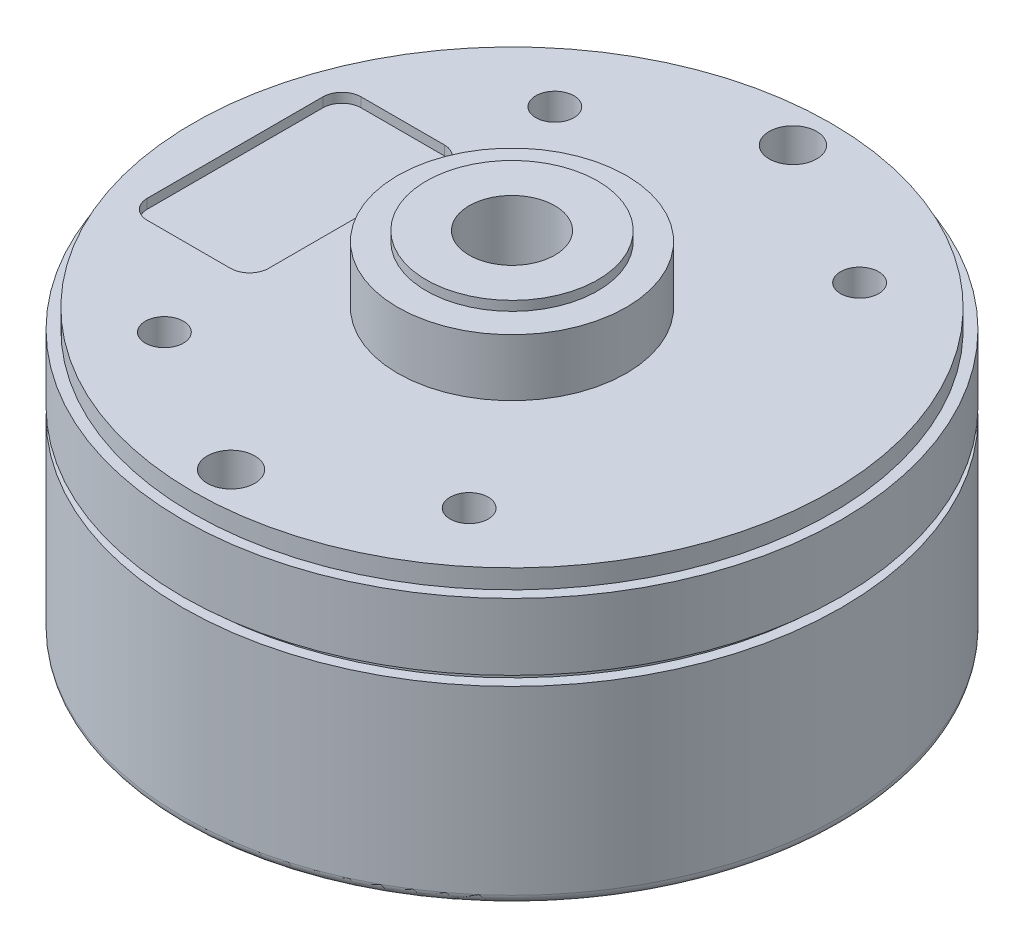
ISO-10303-21;
HEADER;
FILE_DESCRIPTION(('STEP AP214'),'2;1');
FILE_NAME('part.step','',(''),(''),'','','');
FILE_SCHEMA(('AUTOMOTIVE_DESIGN { 1 0 10303 214 1 1 1 1 }'));
ENDSEC;
DATA;
#1=APPLICATION_CONTEXT('core data for automotive mechanical design processes');
#2=APPLICATION_PROTOCOL_DEFINITION('international standard','automotive_design',2000,#1);
#3=PRODUCT_CONTEXT('',#1,'mechanical');
#4=PRODUCT('Part','Part','',(#3));
#5=PRODUCT_RELATED_PRODUCT_CATEGORY('part','',(#4));
#6=PRODUCT_DEFINITION_FORMATION('','',#4);
#7=PRODUCT_DEFINITION_CONTEXT('part definition',#1,'design');
#8=PRODUCT_DEFINITION('design','',#6,#7);
#9=PRODUCT_DEFINITION_SHAPE('','',#8);
#10=(LENGTH_UNIT() NAMED_UNIT(*) SI_UNIT(.MILLI.,.METRE.));
#11=(NAMED_UNIT(*) PLANE_ANGLE_UNIT() SI_UNIT($,.RADIAN.));
#12=(NAMED_UNIT(*) SI_UNIT($,.STERADIAN.) SOLID_ANGLE_UNIT());
#13=UNCERTAINTY_MEASURE_WITH_UNIT(LENGTH_MEASURE(1.E-05),#10,'distance_accuracy_value','');
#14=(GEOMETRIC_REPRESENTATION_CONTEXT(3) GLOBAL_UNCERTAINTY_ASSIGNED_CONTEXT((#13)) GLOBAL_UNIT_ASSIGNED_CONTEXT((#10,
#11,#12)) REPRESENTATION_CONTEXT('',''));
#15=CARTESIAN_POINT('',(0.,0.,0.));
#16=DIRECTION('',(0.,0.,1.));
#17=DIRECTION('',(1.,0.,0.));
#18=AXIS2_PLACEMENT_3D('',#15,#16,#17);
#19=CARTESIAN_POINT('',(0.,0.,0.));
#20=DIRECTION('',(0.,-1.,0.));
#21=DIRECTION('',(0.,0.,-1.));
#22=AXIS2_PLACEMENT_3D('',#19,#20,#21);
#23=CYLINDRICAL_SURFACE('',#22,2.25);
#24=CARTESIAN_POINT('',(0.,18.5,0.));
#25=DIRECTION('',(0.,-1.,0.));
#26=DIRECTION('',(0.,0.,-1.));
#27=AXIS2_PLACEMENT_3D('',#24,#25,#26);
#28=CIRCLE('',#27,2.25);
#29=CARTESIAN_POINT('',(0.,18.5,-2.25));
#30=VERTEX_POINT('',#29);
#31=EDGE_CURVE('E296',#30,#30,#28,.T.);
#32=ORIENTED_EDGE('',*,*,#31,.F.);
#33=EDGE_LOOP('',(#32));
#34=FACE_BOUND('',#33,.T.);
#35=CARTESIAN_POINT('',(0.,1.,0.));
#36=DIRECTION('',(0.,-1.,0.));
#37=DIRECTION('',(0.,0.,-1.));
#38=AXIS2_PLACEMENT_3D('',#35,#36,#37);
#39=CIRCLE('',#38,2.25);
#40=CARTESIAN_POINT('',(0.,1.,-2.25));
#41=VERTEX_POINT('',#40);
#42=EDGE_CURVE('E47',#41,#41,#39,.T.);
#43=ORIENTED_EDGE('',*,*,#42,.T.);
#44=EDGE_LOOP('',(#43));
#45=FACE_BOUND('',#44,.T.);
#46=ADVANCED_FACE('F43',(#34,#45),#23,.F.);
#47=CARTESIAN_POINT('',(17.3,0.,0.));
#48=DIRECTION('',(0.,-1.,0.));
#49=DIRECTION('',(0.,0.,-1.));
#50=AXIS2_PLACEMENT_3D('',#47,#48,#49);
#51=PLANE('',#50);
#52=CARTESIAN_POINT('',(0.,0.,0.));
#53=DIRECTION('',(0.,-1.,0.));
#54=DIRECTION('',(0.,0.,-1.));
#55=AXIS2_PLACEMENT_3D('',#52,#53,#54);
#56=CIRCLE('',#55,3.2);
#57=CARTESIAN_POINT('',(0.,0.,-3.2));
#58=VERTEX_POINT('',#57);
#59=EDGE_CURVE('E164',#58,#58,#56,.T.);
#60=ORIENTED_EDGE('',*,*,#59,.F.);
#61=EDGE_LOOP('',(#60));
#62=FACE_BOUND('',#61,.T.);
#63=CARTESIAN_POINT('',(-5.25,0.,5.25));
#64=DIRECTION('',(0.,-1.,0.));
#65=DIRECTION('',(0.,0.,-1.));
#66=AXIS2_PLACEMENT_3D('',#63,#64,#65);
#67=CIRCLE('',#66,1.25);
#68=CARTESIAN_POINT('',(-5.25,0.,4.));
#69=VERTEX_POINT('',#68);
#70=EDGE_CURVE('E216',#69,#69,#67,.T.);
#71=ORIENTED_EDGE('',*,*,#70,.F.);
#72=EDGE_LOOP('',(#71));
#73=FACE_BOUND('',#72,.T.);
#74=CARTESIAN_POINT('',(-6.25,0.,0.));
#75=DIRECTION('',(0.,-1.,0.));
#76=DIRECTION('',(0.,0.,-1.));
#77=AXIS2_PLACEMENT_3D('',#74,#75,#76);
#78=CIRCLE('',#77,1.);
#79=CARTESIAN_POINT('',(-6.25,0.,-1.));
#80=VERTEX_POINT('',#79);
#81=EDGE_CURVE('E210',#80,#80,#78,.T.);
#82=ORIENTED_EDGE('',*,*,#81,.F.);
#83=EDGE_LOOP('',(#82));
#84=FACE_BOUND('',#83,.T.);
#85=CARTESIAN_POINT('',(-5.25,0.,-5.25));
#86=DIRECTION('',(0.,-1.,0.));
#87=DIRECTION('',(0.,0.,-1.));
#88=AXIS2_PLACEMENT_3D('',#85,#86,#87);
#89=CIRCLE('',#88,1.25);
#90=CARTESIAN_POINT('',(-5.25,0.,-6.5));
#91=VERTEX_POINT('',#90);
#92=EDGE_CURVE('E204',#91,#91,#89,.T.);
#93=ORIENTED_EDGE('',*,*,#92,.F.);
#94=EDGE_LOOP('',(#93));
#95=FACE_BOUND('',#94,.T.);
#96=CARTESIAN_POINT('',(0.,0.,-6.25));
#97=DIRECTION('',(0.,-1.,0.));
#98=DIRECTION('',(0.,0.,-1.));
#99=AXIS2_PLACEMENT_3D('',#96,#97,#98);
#100=CIRCLE('',#99,1.);
#101=CARTESIAN_POINT('',(0.,0.,-7.25));
#102=VERTEX_POINT('',#101);
#103=EDGE_CURVE('E198',#102,#102,#100,.T.);
#104=ORIENTED_EDGE('',*,*,#103,.F.);
#105=EDGE_LOOP('',(#104));
#106=FACE_BOUND('',#105,.T.);
#107=CARTESIAN_POINT('',(5.25,0.,-5.25));
#108=DIRECTION('',(0.,-1.,0.));
#109=DIRECTION('',(0.,0.,-1.));
#110=AXIS2_PLACEMENT_3D('',#107,#108,#109);
#111=CIRCLE('',#110,1.25);
#112=CARTESIAN_POINT('',(5.25,0.,-6.5));
#113=VERTEX_POINT('',#112);
#114=EDGE_CURVE('E192',#113,#113,#111,.T.);
#115=ORIENTED_EDGE('',*,*,#114,.F.);
#116=EDGE_LOOP('',(#115));
#117=FACE_BOUND('',#116,.T.);
#118=CARTESIAN_POINT('',(6.25,0.,0.));
#119=DIRECTION('',(0.,-1.,0.));
#120=DIRECTION('',(0.,0.,-1.));
#121=AXIS2_PLACEMENT_3D('',#118,#119,#120);
#122=CIRCLE('',#121,1.);
#123=CARTESIAN_POINT('',(6.25,0.,-1.));
#124=VERTEX_POINT('',#123);
#125=EDGE_CURVE('E186',#124,#124,#122,.T.);
#126=ORIENTED_EDGE('',*,*,#125,.F.);
#127=EDGE_LOOP('',(#126));
#128=FACE_BOUND('',#127,.T.);
#129=CARTESIAN_POINT('',(5.25,0.,5.25));
#130=DIRECTION('',(0.,-1.,0.));
#131=DIRECTION('',(0.,0.,-1.));
#132=AXIS2_PLACEMENT_3D('',#129,#130,#131);
#133=CIRCLE('',#132,1.25);
#134=CARTESIAN_POINT('',(5.25,0.,4.));
#135=VERTEX_POINT('',#134);
#136=EDGE_CURVE('E179',#135,#135,#133,.T.);
#137=ORIENTED_EDGE('',*,*,#136,.F.);
#138=EDGE_LOOP('',(#137));
#139=FACE_BOUND('',#138,.T.);
#140=CARTESIAN_POINT('',(0.,0.,6.25));
#141=DIRECTION('',(0.,-1.,0.));
#142=DIRECTION('',(0.,0.,-1.));
#143=AXIS2_PLACEMENT_3D('',#140,#141,#142);
#144=CIRCLE('',#143,1.);
#145=CARTESIAN_POINT('',(0.,0.,5.25));
#146=VERTEX_POINT('',#145);
#147=EDGE_CURVE('E182',#146,#146,#144,.T.);
#148=ORIENTED_EDGE('',*,*,#147,.F.);
#149=EDGE_LOOP('',(#148));
#150=FACE_BOUND('',#149,.T.);
#151=CARTESIAN_POINT('',(0.,0.,0.));
#152=DIRECTION('',(0.,-1.,0.));
#153=DIRECTION('',(0.,0.,-1.));
#154=AXIS2_PLACEMENT_3D('',#151,#152,#153);
#155=CIRCLE('',#154,16.8);
#156=CARTESIAN_POINT('',(0.,0.,-16.8));
#157=VERTEX_POINT('',#156);
#158=EDGE_CURVE('E52',#157,#157,#155,.T.);
#159=ORIENTED_EDGE('',*,*,#158,.T.);
#160=EDGE_LOOP('',(#159));
#161=FACE_BOUND('',#160,.T.);
#162=ADVANCED_FACE('F302',(#62,#73,#84,#95,#106,#117,#128,#139,#150,#161),#51,.T.);
#163=CARTESIAN_POINT('',(2.25,18.5,0.));
#164=DIRECTION('',(0.,1.,0.));
#165=DIRECTION('',(0.,0.,1.));
#166=AXIS2_PLACEMENT_3D('',#163,#164,#165);
#167=PLANE('',#166);
#168=ORIENTED_EDGE('',*,*,#31,.T.);
#169=EDGE_LOOP('',(#168));
#170=FACE_BOUND('',#169,.T.);
#171=CARTESIAN_POINT('',(0.,18.5,0.));
#172=DIRECTION('',(0.,-1.,0.));
#173=DIRECTION('',(0.,0.,-1.));
#174=AXIS2_PLACEMENT_3D('',#171,#172,#173);
#175=CIRCLE('',#174,4.5);
#176=CARTESIAN_POINT('',(0.,18.5,-4.5));
#177=VERTEX_POINT('',#176);
#178=EDGE_CURVE('E293',#177,#177,#175,.T.);
#179=ORIENTED_EDGE('',*,*,#178,.F.);
#180=EDGE_LOOP('',(#179));
#181=FACE_BOUND('',#180,.T.);
#182=ADVANCED_FACE('F326',(#170,#181),#167,.T.);
#183=CARTESIAN_POINT('',(0.,0.,0.));
#184=DIRECTION('',(0.,-1.,0.));
#185=DIRECTION('',(0.,0.,-1.));
#186=AXIS2_PLACEMENT_3D('',#183,#184,#185);
#187=CYLINDRICAL_SURFACE('',#186,4.5);
#188=ORIENTED_EDGE('',*,*,#178,.T.);
#189=EDGE_LOOP('',(#188));
#190=FACE_BOUND('',#189,.T.);
#191=CARTESIAN_POINT('',(0.,18.,0.));
#192=DIRECTION('',(0.,-1.,0.));
#193=DIRECTION('',(0.,0.,-1.));
#194=AXIS2_PLACEMENT_3D('',#191,#192,#193);
#195=CIRCLE('',#194,4.5);
#196=CARTESIAN_POINT('',(0.,18.,-4.5));
#197=VERTEX_POINT('',#196);
#198=EDGE_CURVE('E290',#197,#197,#195,.T.);
#199=ORIENTED_EDGE('',*,*,#198,.F.);
#200=EDGE_LOOP('',(#199));
#201=FACE_BOUND('',#200,.T.);
#202=ADVANCED_FACE('F333',(#190,#201),#187,.T.);
#203=CARTESIAN_POINT('',(4.5,18.,0.));
#204=DIRECTION('',(0.,1.,0.));
#205=DIRECTION('',(0.,0.,1.));
#206=AXIS2_PLACEMENT_3D('',#203,#204,#205);
#207=PLANE('',#206);
#208=ORIENTED_EDGE('',*,*,#198,.T.);
#209=EDGE_LOOP('',(#208));
#210=FACE_BOUND('',#209,.T.);
#211=CARTESIAN_POINT('',(0.,18.,0.));
#212=DIRECTION('',(0.,-1.,0.));
#213=DIRECTION('',(0.,0.,-1.));
#214=AXIS2_PLACEMENT_3D('',#211,#212,#213);
#215=CIRCLE('',#214,6.);
#216=CARTESIAN_POINT('',(0.,18.,-6.));
#217=VERTEX_POINT('',#216);
#218=EDGE_CURVE('E287',#217,#217,#215,.T.);
#219=ORIENTED_EDGE('',*,*,#218,.F.);
#220=EDGE_LOOP('',(#219));
#221=FACE_BOUND('',#220,.T.);
#222=ADVANCED_FACE('F337',(#210,#221),#207,.T.);
#223=CARTESIAN_POINT('',(0.,0.,0.));
#224=DIRECTION('',(0.,-1.,0.));
#225=DIRECTION('',(0.,0.,-1.));
#226=AXIS2_PLACEMENT_3D('',#223,#224,#225);
#227=CYLINDRICAL_SURFACE('',#226,6.);
#228=ORIENTED_EDGE('',*,*,#218,.T.);
#229=EDGE_LOOP('',(#228));
#230=FACE_BOUND('',#229,.T.);
#231=CARTESIAN_POINT('',(0.,15.,0.));
#232=DIRECTION('',(0.,-1.,0.));
#233=DIRECTION('',(0.,0.,-1.));
#234=AXIS2_PLACEMENT_3D('',#231,#232,#233);
#235=CIRCLE('',#234,6.);
#236=CARTESIAN_POINT('',(0.,15.,-6.));
#237=VERTEX_POINT('',#236);
#238=EDGE_CURVE('E284',#237,#237,#235,.T.);
#239=ORIENTED_EDGE('',*,*,#238,.F.);
#240=EDGE_LOOP('',(#239));
#241=FACE_BOUND('',#240,.T.);
#242=ADVANCED_FACE('F341',(#230,#241),#227,.T.);
#243=CARTESIAN_POINT('',(6.,15.,0.));
#244=DIRECTION('',(0.,1.,0.));
#245=DIRECTION('',(0.,0.,1.));
#246=AXIS2_PLACEMENT_3D('',#243,#244,#245);
#247=PLANE('',#246);
#248=CARTESIAN_POINT('',(-9.16506311086497,15.,4.61398536738231));
#249=DIRECTION('',(0.,1.,0.));
#250=DIRECTION('',(0.,0.,1.));
#251=AXIS2_PLACEMENT_3D('',#248,#249,#250);
#252=CIRCLE('',#251,1.);
#253=CARTESIAN_POINT('',(-9.16506311086497,15.,5.61398536738231));
#254=VERTEX_POINT('',#253);
#255=CARTESIAN_POINT('',(-8.16506311086497,15.,4.61398536738231));
#256=VERTEX_POINT('',#255);
#257=EDGE_CURVE('E59',#254,#256,#252,.T.);
#258=ORIENTED_EDGE('',*,*,#257,.F.);
#259=DIRECTION('',(1.,0.,0.));
#260=VECTOR('',#259,1.);
#261=CARTESIAN_POINT('',(-13.5382356093968,15.,5.61398536738231));
#262=LINE('',#261,#260);
#263=CARTESIAN_POINT('',(-13.5382356093968,15.,5.61398536738231));
#264=VERTEX_POINT('',#263);
#265=EDGE_CURVE('E160',#264,#254,#262,.T.);
#266=ORIENTED_EDGE('',*,*,#265,.F.);
#267=CARTESIAN_POINT('',(-13.5382356093968,15.,4.61398536738231));
#268=DIRECTION('',(0.,1.,0.));
#269=DIRECTION('',(0.,0.,-1.));
#270=AXIS2_PLACEMENT_3D('',#267,#268,#269);
#271=CIRCLE('',#270,1.);
#272=CARTESIAN_POINT('',(-14.5382356093968,15.,4.61398536738231));
#273=VERTEX_POINT('',#272);
#274=EDGE_CURVE('E158',#273,#264,#271,.T.);
#275=ORIENTED_EDGE('',*,*,#274,.F.);
#276=DIRECTION('',(0.,0.,1.));
#277=VECTOR('',#276,1.);
#278=CARTESIAN_POINT('',(-14.5382356093968,15.,4.61398536738231));
#279=LINE('',#278,#277);
#280=CARTESIAN_POINT('',(-14.5382356093968,15.,-4.61398536738231));
#281=VERTEX_POINT('',#280);
#282=EDGE_CURVE('E119',#281,#273,#279,.T.);
#283=ORIENTED_EDGE('',*,*,#282,.F.);
#284=CARTESIAN_POINT('',(-13.5382356093968,15.,-4.61398536738231));
#285=DIRECTION('',(0.,1.,0.));
#286=DIRECTION('',(0.,0.,-1.));
#287=AXIS2_PLACEMENT_3D('',#284,#285,#286);
#288=CIRCLE('',#287,1.);
#289=CARTESIAN_POINT('',(-13.5382356093968,15.,-5.61398536738231));
#290=VERTEX_POINT('',#289);
#291=EDGE_CURVE('E154',#290,#281,#288,.T.);
#292=ORIENTED_EDGE('',*,*,#291,.F.);
#293=DIRECTION('',(-1.,0.,0.));
#294=VECTOR('',#293,1.);
#295=CARTESIAN_POINT('',(-13.5382356093968,15.,-5.61398536738231));
#296=LINE('',#295,#294);
#297=CARTESIAN_POINT('',(-9.16506311086497,15.,-5.61398536738231));
#298=VERTEX_POINT('',#297);
#299=EDGE_CURVE('E151',#298,#290,#296,.T.);
#300=ORIENTED_EDGE('',*,*,#299,.F.);
#301=CARTESIAN_POINT('',(-9.16506311086497,15.,-4.61398536738231));
#302=DIRECTION('',(0.,1.,0.));
#303=DIRECTION('',(0.,0.,-1.));
#304=AXIS2_PLACEMENT_3D('',#301,#302,#303);
#305=CIRCLE('',#304,1.);
#306=CARTESIAN_POINT('',(-8.16506311086497,15.,-4.61398536738231));
#307=VERTEX_POINT('',#306);
#308=EDGE_CURVE('E148',#307,#298,#305,.T.);
#309=ORIENTED_EDGE('',*,*,#308,.F.);
#310=DIRECTION('',(0.,0.,-1.));
#311=VECTOR('',#310,1.);
#312=CARTESIAN_POINT('',(-8.16506311086497,15.,4.61398536738231));
#313=LINE('',#312,#311);
#314=EDGE_CURVE('E145',#256,#307,#313,.T.);
#315=ORIENTED_EDGE('',*,*,#314,.F.);
#316=EDGE_LOOP('',(#258,#266,#275,#283,#292,#300,#309,#315));
#317=FACE_BOUND('',#316,.T.);
#318=CARTESIAN_POINT('',(0.,15.,14.75));
#319=DIRECTION('',(0.,1.,0.));
#320=DIRECTION('',(0.,0.,-1.));
#321=AXIS2_PLACEMENT_3D('',#318,#319,#320);
#322=CIRCLE('',#321,1.25);
#323=CARTESIAN_POINT('',(0.,15.,13.5));
#324=VERTEX_POINT('',#323);
#325=EDGE_CURVE('E253',#324,#324,#322,.T.);
#326=ORIENTED_EDGE('',*,*,#325,.F.);
#327=EDGE_LOOP('',(#326));
#328=FACE_BOUND('',#327,.T.);
#329=CARTESIAN_POINT('',(0.,15.,-14.75));
#330=DIRECTION('',(0.,1.,0.));
#331=DIRECTION('',(0.,0.,1.));
#332=AXIS2_PLACEMENT_3D('',#329,#330,#331);
#333=CIRCLE('',#332,1.25);
#334=CARTESIAN_POINT('',(0.,15.,-13.5));
#335=VERTEX_POINT('',#334);
#336=EDGE_CURVE('E247',#335,#335,#333,.T.);
#337=ORIENTED_EDGE('',*,*,#336,.F.);
#338=EDGE_LOOP('',(#337));
#339=FACE_BOUND('',#338,.T.);
#340=CARTESIAN_POINT('',(-8.,15.,10.25));
#341=DIRECTION('',(0.,1.,0.));
#342=DIRECTION('',(0.,0.,1.));
#343=AXIS2_PLACEMENT_3D('',#340,#341,#342);
#344=CIRCLE('',#343,1.);
#345=CARTESIAN_POINT('',(-8.,15.,11.25));
#346=VERTEX_POINT('',#345);
#347=EDGE_CURVE('E241',#346,#346,#344,.T.);
#348=ORIENTED_EDGE('',*,*,#347,.F.);
#349=EDGE_LOOP('',(#348));
#350=FACE_BOUND('',#349,.T.);
#351=CARTESIAN_POINT('',(8.,15.,10.25));
#352=DIRECTION('',(0.,1.,0.));
#353=DIRECTION('',(0.,0.,1.));
#354=AXIS2_PLACEMENT_3D('',#351,#352,#353);
#355=CIRCLE('',#354,1.);
#356=CARTESIAN_POINT('',(8.,15.,11.25));
#357=VERTEX_POINT('',#356);
#358=EDGE_CURVE('E235',#357,#357,#355,.T.);
#359=ORIENTED_EDGE('',*,*,#358,.F.);
#360=EDGE_LOOP('',(#359));
#361=FACE_BOUND('',#360,.T.);
#362=CARTESIAN_POINT('',(8.,15.,-10.25));
#363=DIRECTION('',(0.,1.,0.));
#364=DIRECTION('',(0.,0.,1.));
#365=AXIS2_PLACEMENT_3D('',#362,#363,#364);
#366=CIRCLE('',#365,1.);
#367=CARTESIAN_POINT('',(8.,15.,-9.25));
#368=VERTEX_POINT('',#367);
#369=EDGE_CURVE('E228',#368,#368,#366,.T.);
#370=ORIENTED_EDGE('',*,*,#369,.F.);
#371=EDGE_LOOP('',(#370));
#372=FACE_BOUND('',#371,.T.);
#373=CARTESIAN_POINT('',(-8.,15.,-10.25));
#374=DIRECTION('',(0.,1.,0.));
#375=DIRECTION('',(0.,0.,1.));
#376=AXIS2_PLACEMENT_3D('',#373,#374,#375);
#377=CIRCLE('',#376,1.);
#378=CARTESIAN_POINT('',(-8.,15.,-9.25));
#379=VERTEX_POINT('',#378);
#380=EDGE_CURVE('E231',#379,#379,#377,.T.);
#381=ORIENTED_EDGE('',*,*,#380,.F.);
#382=EDGE_LOOP('',(#381));
#383=FACE_BOUND('',#382,.T.);
#384=ORIENTED_EDGE('',*,*,#238,.T.);
#385=EDGE_LOOP('',(#384));
#386=FACE_BOUND('',#385,.T.);
#387=CARTESIAN_POINT('',(0.,15.,0.));
#388=DIRECTION('',(0.,-1.,0.));
#389=DIRECTION('',(0.,0.,-1.));
#390=AXIS2_PLACEMENT_3D('',#387,#388,#389);
#391=CIRCLE('',#390,16.75);
#392=CARTESIAN_POINT('',(0.,15.,-16.75));
#393=VERTEX_POINT('',#392);
#394=EDGE_CURVE('E281',#393,#393,#391,.T.);
#395=ORIENTED_EDGE('',*,*,#394,.F.);
#396=EDGE_LOOP('',(#395));
#397=FACE_BOUND('',#396,.T.);
#398=ADVANCED_FACE('F345',(#317,#328,#339,#350,#361,#372,#383,#386,#397),#247,.T.);
#399=CARTESIAN_POINT('',(0.,0.,0.));
#400=DIRECTION('',(0.,-1.,0.));
#401=DIRECTION('',(0.,0.,-1.));
#402=AXIS2_PLACEMENT_3D('',#399,#400,#401);
#403=CYLINDRICAL_SURFACE('',#402,16.75);
#404=ORIENTED_EDGE('',*,*,#394,.T.);
#405=EDGE_LOOP('',(#404));
#406=FACE_BOUND('',#405,.T.);
#407=CARTESIAN_POINT('',(0.,14.,0.));
#408=DIRECTION('',(0.,-1.,0.));
#409=DIRECTION('',(0.,0.,-1.));
#410=AXIS2_PLACEMENT_3D('',#407,#408,#409);
#411=CIRCLE('',#410,16.75);
#412=CARTESIAN_POINT('',(0.,14.,-16.75));
#413=VERTEX_POINT('',#412);
#414=EDGE_CURVE('E278',#413,#413,#411,.T.);
#415=ORIENTED_EDGE('',*,*,#414,.F.);
#416=EDGE_LOOP('',(#415));
#417=FACE_BOUND('',#416,.T.);
#418=ADVANCED_FACE('F349',(#406,#417),#403,.T.);
#419=CARTESIAN_POINT('',(16.75,14.,0.));
#420=DIRECTION('',(0.,1.,0.));
#421=DIRECTION('',(0.,0.,1.));
#422=AXIS2_PLACEMENT_3D('',#419,#420,#421);
#423=PLANE('',#422);
#424=ORIENTED_EDGE('',*,*,#414,.T.);
#425=EDGE_LOOP('',(#424));
#426=FACE_BOUND('',#425,.T.);
#427=CARTESIAN_POINT('',(0.,14.,0.));
#428=DIRECTION('',(0.,-1.,0.));
#429=DIRECTION('',(0.,0.,-1.));
#430=AXIS2_PLACEMENT_3D('',#427,#428,#429);
#431=CIRCLE('',#430,17.3);
#432=CARTESIAN_POINT('',(0.,14.,-17.3));
#433=VERTEX_POINT('',#432);
#434=EDGE_CURVE('E275',#433,#433,#431,.T.);
#435=ORIENTED_EDGE('',*,*,#434,.F.);
#436=EDGE_LOOP('',(#435));
#437=FACE_BOUND('',#436,.T.);
#438=ADVANCED_FACE('F353',(#426,#437),#423,.T.);
#439=CARTESIAN_POINT('',(0.,0.,0.));
#440=DIRECTION('',(0.,-1.,0.));
#441=DIRECTION('',(0.,0.,-1.));
#442=AXIS2_PLACEMENT_3D('',#439,#440,#441);
#443=CYLINDRICAL_SURFACE('',#442,17.3);
#444=ORIENTED_EDGE('',*,*,#434,.T.);
#445=EDGE_LOOP('',(#444));
#446=FACE_BOUND('',#445,.T.);
#447=CARTESIAN_POINT('',(0.,10.5,0.));
#448=DIRECTION('',(0.,-1.,0.));
#449=DIRECTION('',(0.,0.,-1.));
#450=AXIS2_PLACEMENT_3D('',#447,#448,#449);
#451=CIRCLE('',#450,17.3);
#452=CARTESIAN_POINT('',(0.,10.5,-17.3));
#453=VERTEX_POINT('',#452);
#454=EDGE_CURVE('E272',#453,#453,#451,.T.);
#455=ORIENTED_EDGE('',*,*,#454,.F.);
#456=EDGE_LOOP('',(#455));
#457=FACE_BOUND('',#456,.T.);
#458=ADVANCED_FACE('F357',(#446,#457),#443,.T.);
#459=CARTESIAN_POINT('',(17.3,10.5,0.));
#460=DIRECTION('',(0.,-1.,0.));
#461=DIRECTION('',(0.,0.,-1.));
#462=AXIS2_PLACEMENT_3D('',#459,#460,#461);
#463=PLANE('',#462);
#464=ORIENTED_EDGE('',*,*,#454,.T.);
#465=EDGE_LOOP('',(#464));
#466=FACE_BOUND('',#465,.T.);
#467=CARTESIAN_POINT('',(0.,10.5,0.));
#468=DIRECTION('',(0.,-1.,0.));
#469=DIRECTION('',(0.,0.,-1.));
#470=AXIS2_PLACEMENT_3D('',#467,#468,#469);
#471=CIRCLE('',#470,16.75);
#472=CARTESIAN_POINT('',(0.,10.5,-16.75));
#473=VERTEX_POINT('',#472);
#474=EDGE_CURVE('E269',#473,#473,#471,.T.);
#475=ORIENTED_EDGE('',*,*,#474,.F.);
#476=EDGE_LOOP('',(#475));
#477=FACE_BOUND('',#476,.T.);
#478=ADVANCED_FACE('F361',(#466,#477),#463,.T.);
#479=CARTESIAN_POINT('',(0.,0.,0.));
#480=DIRECTION('',(0.,-1.,0.));
#481=DIRECTION('',(0.,0.,-1.));
#482=AXIS2_PLACEMENT_3D('',#479,#480,#481);
#483=CYLINDRICAL_SURFACE('',#482,16.75);
#484=ORIENTED_EDGE('',*,*,#474,.T.);
#485=EDGE_LOOP('',(#484));
#486=FACE_BOUND('',#485,.T.);
#487=CARTESIAN_POINT('',(0.,10.,0.));
#488=DIRECTION('',(0.,-1.,0.));
#489=DIRECTION('',(0.,0.,-1.));
#490=AXIS2_PLACEMENT_3D('',#487,#488,#489);
#491=CIRCLE('',#490,16.75);
#492=CARTESIAN_POINT('',(0.,10.,-16.75));
#493=VERTEX_POINT('',#492);
#494=EDGE_CURVE('E266',#493,#493,#491,.T.);
#495=ORIENTED_EDGE('',*,*,#494,.F.);
#496=EDGE_LOOP('',(#495));
#497=FACE_BOUND('',#496,.T.);
#498=ADVANCED_FACE('F365',(#486,#497),#483,.T.);
#499=CARTESIAN_POINT('',(16.75,10.,0.));
#500=DIRECTION('',(0.,1.,0.));
#501=DIRECTION('',(0.,0.,1.));
#502=AXIS2_PLACEMENT_3D('',#499,#500,#501);
#503=PLANE('',#502);
#504=ORIENTED_EDGE('',*,*,#494,.T.);
#505=EDGE_LOOP('',(#504));
#506=FACE_BOUND('',#505,.T.);
#507=CARTESIAN_POINT('',(0.,10.,0.));
#508=DIRECTION('',(0.,-1.,0.));
#509=DIRECTION('',(0.,0.,-1.));
#510=AXIS2_PLACEMENT_3D('',#507,#508,#509);
#511=CIRCLE('',#510,17.3);
#512=CARTESIAN_POINT('',(0.,10.,-17.3));
#513=VERTEX_POINT('',#512);
#514=EDGE_CURVE('E261',#513,#513,#511,.T.);
#515=ORIENTED_EDGE('',*,*,#514,.F.);
#516=EDGE_LOOP('',(#515));
#517=FACE_BOUND('',#516,.T.);
#518=ADVANCED_FACE('F315',(#506,#517),#503,.T.);
#519=CARTESIAN_POINT('',(0.,0.,0.));
#520=DIRECTION('',(0.,-1.,0.));
#521=DIRECTION('',(0.,0.,-1.));
#522=AXIS2_PLACEMENT_3D('',#519,#520,#521);
#523=CYLINDRICAL_SURFACE('',#522,17.3);
#524=CARTESIAN_POINT('',(0.,0.499999999999999,0.));
#525=DIRECTION('',(0.,-1.,0.));
#526=DIRECTION('',(0.,0.,-1.));
#527=AXIS2_PLACEMENT_3D('',#524,#525,#526);
#528=CIRCLE('',#527,17.3);
#529=CARTESIAN_POINT('',(0.,0.499999999999999,-17.3));
#530=VERTEX_POINT('',#529);
#531=EDGE_CURVE('E11',#530,#530,#528,.F.);
#532=ORIENTED_EDGE('',*,*,#531,.T.);
#533=EDGE_LOOP('',(#532));
#534=FACE_BOUND('',#533,.T.);
#535=ORIENTED_EDGE('',*,*,#514,.T.);
#536=EDGE_LOOP('',(#535));
#537=FACE_BOUND('',#536,.T.);
#538=ADVANCED_FACE('F306',(#534,#537),#523,.T.);
#539=CARTESIAN_POINT('',(0.,0.499999999999999,0.));
#540=DIRECTION('',(0.,-1.,0.));
#541=DIRECTION('',(0.,0.,-1.));
#542=AXIS2_PLACEMENT_3D('',#539,#540,#541);
#543=TOROIDAL_SURFACE('',#542,16.8,0.5);
#544=ORIENTED_EDGE('',*,*,#531,.F.);
#545=EDGE_LOOP('',(#544));
#546=FACE_BOUND('',#545,.T.);
#547=ORIENTED_EDGE('',*,*,#158,.F.);
#548=EDGE_LOOP('',(#547));
#549=FACE_BOUND('',#548,.T.);
#550=ADVANCED_FACE('F45',(#546,#549),#543,.T.);
#551=CARTESIAN_POINT('',(-8.,11.,-10.25));
#552=DIRECTION('',(0.,1.,0.));
#553=DIRECTION('',(0.,0.,1.));
#554=AXIS2_PLACEMENT_3D('',#551,#552,#553);
#555=CYLINDRICAL_SURFACE('',#554,1.);
#556=CARTESIAN_POINT('',(-8.,11.,-10.25));
#557=DIRECTION('',(0.,1.,0.));
#558=DIRECTION('',(0.,0.,1.));
#559=AXIS2_PLACEMENT_3D('',#556,#557,#558);
#560=CIRCLE('',#559,1.);
#561=CARTESIAN_POINT('',(-8.,11.,-9.25));
#562=VERTEX_POINT('',#561);
#563=EDGE_CURVE('E258',#562,#562,#560,.T.);
#564=ORIENTED_EDGE('',*,*,#563,.F.);
#565=EDGE_LOOP('',(#564));
#566=FACE_BOUND('',#565,.T.);
#567=ORIENTED_EDGE('',*,*,#380,.T.);
#568=EDGE_LOOP('',(#567));
#569=FACE_BOUND('',#568,.T.);
#570=ADVANCED_FACE('F305',(#566,#569),#555,.F.);
#571=CARTESIAN_POINT('',(-8.,11.,-10.25));
#572=DIRECTION('',(0.,1.,0.));
#573=DIRECTION('',(0.,0.,1.));
#574=AXIS2_PLACEMENT_3D('',#571,#572,#573);
#575=PLANE('',#574);
#576=ORIENTED_EDGE('',*,*,#563,.T.);
#577=EDGE_LOOP('',(#576));
#578=FACE_BOUND('',#577,.T.);
#579=ADVANCED_FACE('F312',(#578),#575,.T.);
#580=CARTESIAN_POINT('',(8.,11.,-10.25));
#581=DIRECTION('',(0.,1.,0.));
#582=DIRECTION('',(0.,0.,1.));
#583=AXIS2_PLACEMENT_3D('',#580,#581,#582);
#584=CYLINDRICAL_SURFACE('',#583,1.);
#585=CARTESIAN_POINT('',(8.,11.,-10.25));
#586=DIRECTION('',(0.,1.,0.));
#587=DIRECTION('',(0.,0.,1.));
#588=AXIS2_PLACEMENT_3D('',#585,#586,#587);
#589=CIRCLE('',#588,1.);
#590=CARTESIAN_POINT('',(8.,11.,-9.25));
#591=VERTEX_POINT('',#590);
#592=EDGE_CURVE('E232',#591,#591,#589,.T.);
#593=ORIENTED_EDGE('',*,*,#592,.F.);
#594=EDGE_LOOP('',(#593));
#595=FACE_BOUND('',#594,.T.);
#596=ORIENTED_EDGE('',*,*,#369,.T.);
#597=EDGE_LOOP('',(#596));
#598=FACE_BOUND('',#597,.T.);
#599=ADVANCED_FACE('F375',(#595,#598),#584,.F.);
#600=CARTESIAN_POINT('',(8.,11.,-10.25));
#601=DIRECTION('',(0.,1.,0.));
#602=DIRECTION('',(0.,0.,1.));
#603=AXIS2_PLACEMENT_3D('',#600,#601,#602);
#604=PLANE('',#603);
#605=ORIENTED_EDGE('',*,*,#592,.T.);
#606=EDGE_LOOP('',(#605));
#607=FACE_BOUND('',#606,.T.);
#608=ADVANCED_FACE('F409',(#607),#604,.T.);
#609=CARTESIAN_POINT('',(8.,11.,10.25));
#610=DIRECTION('',(0.,1.,0.));
#611=DIRECTION('',(0.,0.,1.));
#612=AXIS2_PLACEMENT_3D('',#609,#610,#611);
#613=CYLINDRICAL_SURFACE('',#612,1.);
#614=CARTESIAN_POINT('',(8.,11.,10.25));
#615=DIRECTION('',(0.,1.,0.));
#616=DIRECTION('',(0.,0.,1.));
#617=AXIS2_PLACEMENT_3D('',#614,#615,#616);
#618=CIRCLE('',#617,1.);
#619=CARTESIAN_POINT('',(8.,11.,11.25));
#620=VERTEX_POINT('',#619);
#621=EDGE_CURVE('E238',#620,#620,#618,.T.);
#622=ORIENTED_EDGE('',*,*,#621,.F.);
#623=EDGE_LOOP('',(#622));
#624=FACE_BOUND('',#623,.T.);
#625=ORIENTED_EDGE('',*,*,#358,.T.);
#626=EDGE_LOOP('',(#625));
#627=FACE_BOUND('',#626,.T.);
#628=ADVANCED_FACE('F405',(#624,#627),#613,.F.);
#629=CARTESIAN_POINT('',(8.,11.,10.25));
#630=DIRECTION('',(0.,1.,0.));
#631=DIRECTION('',(0.,0.,1.));
#632=AXIS2_PLACEMENT_3D('',#629,#630,#631);
#633=PLANE('',#632);
#634=ORIENTED_EDGE('',*,*,#621,.T.);
#635=EDGE_LOOP('',(#634));
#636=FACE_BOUND('',#635,.T.);
#637=ADVANCED_FACE('F401',(#636),#633,.T.);
#638=CARTESIAN_POINT('',(-8.,11.,10.25));
#639=DIRECTION('',(0.,1.,0.));
#640=DIRECTION('',(0.,0.,1.));
#641=AXIS2_PLACEMENT_3D('',#638,#639,#640);
#642=CYLINDRICAL_SURFACE('',#641,1.);
#643=CARTESIAN_POINT('',(-8.,11.,10.25));
#644=DIRECTION('',(0.,1.,0.));
#645=DIRECTION('',(0.,0.,1.));
#646=AXIS2_PLACEMENT_3D('',#643,#644,#645);
#647=CIRCLE('',#646,1.);
#648=CARTESIAN_POINT('',(-8.,11.,11.25));
#649=VERTEX_POINT('',#648);
#650=EDGE_CURVE('E244',#649,#649,#647,.T.);
#651=ORIENTED_EDGE('',*,*,#650,.F.);
#652=EDGE_LOOP('',(#651));
#653=FACE_BOUND('',#652,.T.);
#654=ORIENTED_EDGE('',*,*,#347,.T.);
#655=EDGE_LOOP('',(#654));
#656=FACE_BOUND('',#655,.T.);
#657=ADVANCED_FACE('F397',(#653,#656),#642,.F.);
#658=CARTESIAN_POINT('',(-8.,11.,10.25));
#659=DIRECTION('',(0.,1.,0.));
#660=DIRECTION('',(0.,0.,1.));
#661=AXIS2_PLACEMENT_3D('',#658,#659,#660);
#662=PLANE('',#661);
#663=ORIENTED_EDGE('',*,*,#650,.T.);
#664=EDGE_LOOP('',(#663));
#665=FACE_BOUND('',#664,.T.);
#666=ADVANCED_FACE('F393',(#665),#662,.T.);
#667=CARTESIAN_POINT('',(0.,11.,-14.75));
#668=DIRECTION('',(0.,1.,0.));
#669=DIRECTION('',(0.,0.,1.));
#670=AXIS2_PLACEMENT_3D('',#667,#668,#669);
#671=CYLINDRICAL_SURFACE('',#670,1.25);
#672=CARTESIAN_POINT('',(0.,11.,-14.75));
#673=DIRECTION('',(0.,1.,0.));
#674=DIRECTION('',(0.,0.,1.));
#675=AXIS2_PLACEMENT_3D('',#672,#673,#674);
#676=CIRCLE('',#675,1.25);
#677=CARTESIAN_POINT('',(0.,11.,-13.5));
#678=VERTEX_POINT('',#677);
#679=EDGE_CURVE('E250',#678,#678,#676,.T.);
#680=ORIENTED_EDGE('',*,*,#679,.F.);
#681=EDGE_LOOP('',(#680));
#682=FACE_BOUND('',#681,.T.);
#683=ORIENTED_EDGE('',*,*,#336,.T.);
#684=EDGE_LOOP('',(#683));
#685=FACE_BOUND('',#684,.T.);
#686=ADVANCED_FACE('F389',(#682,#685),#671,.F.);
#687=CARTESIAN_POINT('',(0.,11.,-14.75));
#688=DIRECTION('',(0.,1.,0.));
#689=DIRECTION('',(0.,0.,1.));
#690=AXIS2_PLACEMENT_3D('',#687,#688,#689);
#691=PLANE('',#690);
#692=ORIENTED_EDGE('',*,*,#679,.T.);
#693=EDGE_LOOP('',(#692));
#694=FACE_BOUND('',#693,.T.);
#695=ADVANCED_FACE('F385',(#694),#691,.T.);
#696=CARTESIAN_POINT('',(0.,11.,14.75));
#697=DIRECTION('',(0.,1.,0.));
#698=DIRECTION('',(0.,0.,1.));
#699=AXIS2_PLACEMENT_3D('',#696,#697,#698);
#700=CYLINDRICAL_SURFACE('',#699,1.25);
#701=CARTESIAN_POINT('',(0.,11.,14.75));
#702=DIRECTION('',(0.,1.,0.));
#703=DIRECTION('',(0.,0.,-1.));
#704=AXIS2_PLACEMENT_3D('',#701,#702,#703);
#705=CIRCLE('',#704,1.25);
#706=CARTESIAN_POINT('',(0.,11.,13.5));
#707=VERTEX_POINT('',#706);
#708=EDGE_CURVE('E225',#707,#707,#705,.T.);
#709=ORIENTED_EDGE('',*,*,#708,.F.);
#710=EDGE_LOOP('',(#709));
#711=FACE_BOUND('',#710,.T.);
#712=ORIENTED_EDGE('',*,*,#325,.T.);
#713=EDGE_LOOP('',(#712));
#714=FACE_BOUND('',#713,.T.);
#715=ADVANCED_FACE('F381',(#711,#714),#700,.F.);
#716=CARTESIAN_POINT('',(0.,11.,14.75));
#717=DIRECTION('',(0.,-1.,0.));
#718=DIRECTION('',(0.,0.,-1.));
#719=AXIS2_PLACEMENT_3D('',#716,#717,#718);
#720=PLANE('',#719);
#721=ORIENTED_EDGE('',*,*,#708,.T.);
#722=EDGE_LOOP('',(#721));
#723=FACE_BOUND('',#722,.T.);
#724=ADVANCED_FACE('F377',(#723),#720,.F.);
#725=CARTESIAN_POINT('',(0.,4.,6.25));
#726=DIRECTION('',(0.,-1.,0.));
#727=DIRECTION('',(0.,0.,-1.));
#728=AXIS2_PLACEMENT_3D('',#725,#726,#727);
#729=CYLINDRICAL_SURFACE('',#728,1.);
#730=CARTESIAN_POINT('',(0.,4.,6.25));
#731=DIRECTION('',(0.,-1.,0.));
#732=DIRECTION('',(0.,0.,-1.));
#733=AXIS2_PLACEMENT_3D('',#730,#731,#732);
#734=CIRCLE('',#733,1.);
#735=CARTESIAN_POINT('',(0.,4.,5.25));
#736=VERTEX_POINT('',#735);
#737=EDGE_CURVE('E222',#736,#736,#734,.T.);
#738=ORIENTED_EDGE('',*,*,#737,.F.);
#739=EDGE_LOOP('',(#738));
#740=FACE_BOUND('',#739,.T.);
#741=ORIENTED_EDGE('',*,*,#147,.T.);
#742=EDGE_LOOP('',(#741));
#743=FACE_BOUND('',#742,.T.);
#744=ADVANCED_FACE('F380',(#740,#743),#729,.F.);
#745=CARTESIAN_POINT('',(0.,4.,6.25));
#746=DIRECTION('',(0.,-1.,0.));
#747=DIRECTION('',(0.,0.,-1.));
#748=AXIS2_PLACEMENT_3D('',#745,#746,#747);
#749=PLANE('',#748);
#750=ORIENTED_EDGE('',*,*,#737,.T.);
#751=EDGE_LOOP('',(#750));
#752=FACE_BOUND('',#751,.T.);
#753=ADVANCED_FACE('F419',(#752),#749,.T.);
#754=CARTESIAN_POINT('',(5.25,4.,5.25));
#755=DIRECTION('',(0.,-1.,0.));
#756=DIRECTION('',(0.,0.,-1.));
#757=AXIS2_PLACEMENT_3D('',#754,#755,#756);
#758=CYLINDRICAL_SURFACE('',#757,1.25);
#759=CARTESIAN_POINT('',(5.25,4.,5.25));
#760=DIRECTION('',(0.,-1.,0.));
#761=DIRECTION('',(0.,0.,-1.));
#762=AXIS2_PLACEMENT_3D('',#759,#760,#761);
#763=CIRCLE('',#762,1.25);
#764=CARTESIAN_POINT('',(5.25,4.,4.));
#765=VERTEX_POINT('',#764);
#766=EDGE_CURVE('E183',#765,#765,#763,.T.);
#767=ORIENTED_EDGE('',*,*,#766,.F.);
#768=EDGE_LOOP('',(#767));
#769=FACE_BOUND('',#768,.T.);
#770=ORIENTED_EDGE('',*,*,#136,.T.);
#771=EDGE_LOOP('',(#770));
#772=FACE_BOUND('',#771,.T.);
#773=ADVANCED_FACE('F423',(#769,#772),#758,.F.);
#774=CARTESIAN_POINT('',(5.25,4.,5.25));
#775=DIRECTION('',(0.,-1.,0.));
#776=DIRECTION('',(0.,0.,-1.));
#777=AXIS2_PLACEMENT_3D('',#774,#775,#776);
#778=PLANE('',#777);
#779=ORIENTED_EDGE('',*,*,#766,.T.);
#780=EDGE_LOOP('',(#779));
#781=FACE_BOUND('',#780,.T.);
#782=ADVANCED_FACE('F472',(#781),#778,.T.);
#783=CARTESIAN_POINT('',(6.25,4.,0.));
#784=DIRECTION('',(0.,-1.,0.));
#785=DIRECTION('',(0.,0.,-1.));
#786=AXIS2_PLACEMENT_3D('',#783,#784,#785);
#787=CYLINDRICAL_SURFACE('',#786,1.);
#788=CARTESIAN_POINT('',(6.25,4.,0.));
#789=DIRECTION('',(0.,-1.,0.));
#790=DIRECTION('',(0.,0.,-1.));
#791=AXIS2_PLACEMENT_3D('',#788,#789,#790);
#792=CIRCLE('',#791,1.);
#793=CARTESIAN_POINT('',(6.25,4.,-1.));
#794=VERTEX_POINT('',#793);
#795=EDGE_CURVE('E189',#794,#794,#792,.T.);
#796=ORIENTED_EDGE('',*,*,#795,.F.);
#797=EDGE_LOOP('',(#796));
#798=FACE_BOUND('',#797,.T.);
#799=ORIENTED_EDGE('',*,*,#125,.T.);
#800=EDGE_LOOP('',(#799));
#801=FACE_BOUND('',#800,.T.);
#802=ADVANCED_FACE('F468',(#798,#801),#787,.F.);
#803=CARTESIAN_POINT('',(6.25,4.,0.));
#804=DIRECTION('',(0.,-1.,0.));
#805=DIRECTION('',(0.,0.,-1.));
#806=AXIS2_PLACEMENT_3D('',#803,#804,#805);
#807=PLANE('',#806);
#808=ORIENTED_EDGE('',*,*,#795,.T.);
#809=EDGE_LOOP('',(#808));
#810=FACE_BOUND('',#809,.T.);
#811=ADVANCED_FACE('F464',(#810),#807,.T.);
#812=CARTESIAN_POINT('',(5.25,4.,-5.25));
#813=DIRECTION('',(0.,-1.,0.));
#814=DIRECTION('',(0.,0.,-1.));
#815=AXIS2_PLACEMENT_3D('',#812,#813,#814);
#816=CYLINDRICAL_SURFACE('',#815,1.25);
#817=CARTESIAN_POINT('',(5.25,4.,-5.25));
#818=DIRECTION('',(0.,-1.,0.));
#819=DIRECTION('',(0.,0.,-1.));
#820=AXIS2_PLACEMENT_3D('',#817,#818,#819);
#821=CIRCLE('',#820,1.25);
#822=CARTESIAN_POINT('',(5.25,4.,-6.5));
#823=VERTEX_POINT('',#822);
#824=EDGE_CURVE('E195',#823,#823,#821,.T.);
#825=ORIENTED_EDGE('',*,*,#824,.F.);
#826=EDGE_LOOP('',(#825));
#827=FACE_BOUND('',#826,.T.);
#828=ORIENTED_EDGE('',*,*,#114,.T.);
#829=EDGE_LOOP('',(#828));
#830=FACE_BOUND('',#829,.T.);
#831=ADVANCED_FACE('F460',(#827,#830),#816,.F.);
#832=CARTESIAN_POINT('',(5.25,4.,-5.25));
#833=DIRECTION('',(0.,-1.,0.));
#834=DIRECTION('',(0.,0.,-1.));
#835=AXIS2_PLACEMENT_3D('',#832,#833,#834);
#836=PLANE('',#835);
#837=ORIENTED_EDGE('',*,*,#824,.T.);
#838=EDGE_LOOP('',(#837));
#839=FACE_BOUND('',#838,.T.);
#840=ADVANCED_FACE('F456',(#839),#836,.T.);
#841=CARTESIAN_POINT('',(0.,4.,-6.25));
#842=DIRECTION('',(0.,-1.,0.));
#843=DIRECTION('',(0.,0.,-1.));
#844=AXIS2_PLACEMENT_3D('',#841,#842,#843);
#845=CYLINDRICAL_SURFACE('',#844,1.);
#846=CARTESIAN_POINT('',(0.,4.,-6.25));
#847=DIRECTION('',(0.,-1.,0.));
#848=DIRECTION('',(0.,0.,-1.));
#849=AXIS2_PLACEMENT_3D('',#846,#847,#848);
#850=CIRCLE('',#849,1.);
#851=CARTESIAN_POINT('',(0.,4.,-7.25));
#852=VERTEX_POINT('',#851);
#853=EDGE_CURVE('E201',#852,#852,#850,.T.);
#854=ORIENTED_EDGE('',*,*,#853,.F.);
#855=EDGE_LOOP('',(#854));
#856=FACE_BOUND('',#855,.T.);
#857=ORIENTED_EDGE('',*,*,#103,.T.);
#858=EDGE_LOOP('',(#857));
#859=FACE_BOUND('',#858,.T.);
#860=ADVANCED_FACE('F452',(#856,#859),#845,.F.);
#861=CARTESIAN_POINT('',(0.,4.,-6.25));
#862=DIRECTION('',(0.,-1.,0.));
#863=DIRECTION('',(0.,0.,-1.));
#864=AXIS2_PLACEMENT_3D('',#861,#862,#863);
#865=PLANE('',#864);
#866=ORIENTED_EDGE('',*,*,#853,.T.);
#867=EDGE_LOOP('',(#866));
#868=FACE_BOUND('',#867,.T.);
#869=ADVANCED_FACE('F448',(#868),#865,.T.);
#870=CARTESIAN_POINT('',(-5.25,4.,-5.25));
#871=DIRECTION('',(0.,-1.,0.));
#872=DIRECTION('',(0.,0.,-1.));
#873=AXIS2_PLACEMENT_3D('',#870,#871,#872);
#874=CYLINDRICAL_SURFACE('',#873,1.25);
#875=CARTESIAN_POINT('',(-5.25,4.,-5.25));
#876=DIRECTION('',(0.,-1.,0.));
#877=DIRECTION('',(0.,0.,-1.));
#878=AXIS2_PLACEMENT_3D('',#875,#876,#877);
#879=CIRCLE('',#878,1.25);
#880=CARTESIAN_POINT('',(-5.25,4.,-6.5));
#881=VERTEX_POINT('',#880);
#882=EDGE_CURVE('E207',#881,#881,#879,.T.);
#883=ORIENTED_EDGE('',*,*,#882,.F.);
#884=EDGE_LOOP('',(#883));
#885=FACE_BOUND('',#884,.T.);
#886=ORIENTED_EDGE('',*,*,#92,.T.);
#887=EDGE_LOOP('',(#886));
#888=FACE_BOUND('',#887,.T.);
#889=ADVANCED_FACE('F444',(#885,#888),#874,.F.);
#890=CARTESIAN_POINT('',(-5.25,4.,-5.25));
#891=DIRECTION('',(0.,-1.,0.));
#892=DIRECTION('',(0.,0.,-1.));
#893=AXIS2_PLACEMENT_3D('',#890,#891,#892);
#894=PLANE('',#893);
#895=ORIENTED_EDGE('',*,*,#882,.T.);
#896=EDGE_LOOP('',(#895));
#897=FACE_BOUND('',#896,.T.);
#898=ADVANCED_FACE('F440',(#897),#894,.T.);
#899=CARTESIAN_POINT('',(-6.25,4.,0.));
#900=DIRECTION('',(0.,-1.,0.));
#901=DIRECTION('',(0.,0.,-1.));
#902=AXIS2_PLACEMENT_3D('',#899,#900,#901);
#903=CYLINDRICAL_SURFACE('',#902,1.);
#904=CARTESIAN_POINT('',(-6.25,4.,0.));
#905=DIRECTION('',(0.,-1.,0.));
#906=DIRECTION('',(0.,0.,-1.));
#907=AXIS2_PLACEMENT_3D('',#904,#905,#906);
#908=CIRCLE('',#907,1.);
#909=CARTESIAN_POINT('',(-6.25,4.,-1.));
#910=VERTEX_POINT('',#909);
#911=EDGE_CURVE('E213',#910,#910,#908,.T.);
#912=ORIENTED_EDGE('',*,*,#911,.F.);
#913=EDGE_LOOP('',(#912));
#914=FACE_BOUND('',#913,.T.);
#915=ORIENTED_EDGE('',*,*,#81,.T.);
#916=EDGE_LOOP('',(#915));
#917=FACE_BOUND('',#916,.T.);
#918=ADVANCED_FACE('F436',(#914,#917),#903,.F.);
#919=CARTESIAN_POINT('',(-6.25,4.,0.));
#920=DIRECTION('',(0.,-1.,0.));
#921=DIRECTION('',(0.,0.,-1.));
#922=AXIS2_PLACEMENT_3D('',#919,#920,#921);
#923=PLANE('',#922);
#924=ORIENTED_EDGE('',*,*,#911,.T.);
#925=EDGE_LOOP('',(#924));
#926=FACE_BOUND('',#925,.T.);
#927=ADVANCED_FACE('F432',(#926),#923,.T.);
#928=CARTESIAN_POINT('',(-5.25,4.,5.25));
#929=DIRECTION('',(0.,-1.,0.));
#930=DIRECTION('',(0.,0.,-1.));
#931=AXIS2_PLACEMENT_3D('',#928,#929,#930);
#932=CYLINDRICAL_SURFACE('',#931,1.25);
#933=CARTESIAN_POINT('',(-5.25,4.,5.25));
#934=DIRECTION('',(0.,-1.,0.));
#935=DIRECTION('',(0.,0.,-1.));
#936=AXIS2_PLACEMENT_3D('',#933,#934,#935);
#937=CIRCLE('',#936,1.25);
#938=CARTESIAN_POINT('',(-5.25,4.,4.));
#939=VERTEX_POINT('',#938);
#940=EDGE_CURVE('E219',#939,#939,#937,.T.);
#941=ORIENTED_EDGE('',*,*,#940,.F.);
#942=EDGE_LOOP('',(#941));
#943=FACE_BOUND('',#942,.T.);
#944=ORIENTED_EDGE('',*,*,#70,.T.);
#945=EDGE_LOOP('',(#944));
#946=FACE_BOUND('',#945,.T.);
#947=ADVANCED_FACE('F428',(#943,#946),#932,.F.);
#948=CARTESIAN_POINT('',(-5.25,4.,5.25));
#949=DIRECTION('',(0.,-1.,0.));
#950=DIRECTION('',(0.,0.,-1.));
#951=AXIS2_PLACEMENT_3D('',#948,#949,#950);
#952=PLANE('',#951);
#953=ORIENTED_EDGE('',*,*,#940,.T.);
#954=EDGE_LOOP('',(#953));
#955=FACE_BOUND('',#954,.T.);
#956=ADVANCED_FACE('F425',(#955),#952,.T.);
#957=CARTESIAN_POINT('',(0.,1.,0.));
#958=DIRECTION('',(0.,-1.,0.));
#959=DIRECTION('',(0.,0.,-1.));
#960=AXIS2_PLACEMENT_3D('',#957,#958,#959);
#961=CYLINDRICAL_SURFACE('',#960,3.2);
#962=CARTESIAN_POINT('',(0.,1.,0.));
#963=DIRECTION('',(0.,-1.,0.));
#964=DIRECTION('',(0.,0.,-1.));
#965=AXIS2_PLACEMENT_3D('',#962,#963,#964);
#966=CIRCLE('',#965,3.2);
#967=CARTESIAN_POINT('',(0.,1.,-3.2));
#968=VERTEX_POINT('',#967);
#969=EDGE_CURVE('E174',#968,#968,#966,.T.);
#970=ORIENTED_EDGE('',*,*,#969,.F.);
#971=EDGE_LOOP('',(#970));
#972=FACE_BOUND('',#971,.T.);
#973=ORIENTED_EDGE('',*,*,#59,.T.);
#974=EDGE_LOOP('',(#973));
#975=FACE_BOUND('',#974,.T.);
#976=ADVANCED_FACE('F427',(#972,#975),#961,.F.);
#977=CARTESIAN_POINT('',(0.,1.,0.));
#978=DIRECTION('',(0.,-1.,0.));
#979=DIRECTION('',(0.,0.,-1.));
#980=AXIS2_PLACEMENT_3D('',#977,#978,#979);
#981=PLANE('',#980);
#982=ORIENTED_EDGE('',*,*,#42,.F.);
#983=EDGE_LOOP('',(#982));
#984=FACE_BOUND('',#983,.T.);
#985=ORIENTED_EDGE('',*,*,#969,.T.);
#986=EDGE_LOOP('',(#985));
#987=FACE_BOUND('',#986,.T.);
#988=ADVANCED_FACE('F482',(#984,#987),#981,.T.);
#989=CARTESIAN_POINT('',(-9.16506311086497,14.5,4.61398536738231));
#990=DIRECTION('',(0.,1.,0.));
#991=DIRECTION('',(0.,0.,1.));
#992=AXIS2_PLACEMENT_3D('',#989,#990,#991);
#993=CYLINDRICAL_SURFACE('',#992,1.);
#994=ORIENTED_EDGE('',*,*,#257,.T.);
#995=DIRECTION('',(0.,1.,0.));
#996=VECTOR('',#995,1.);
#997=CARTESIAN_POINT('',(-8.16506311086497,14.5,4.61398536738231));
#998=LINE('',#997,#996);
#999=CARTESIAN_POINT('',(-8.16506311086497,14.5,4.61398536738231));
#1000=VERTEX_POINT('',#999);
#1001=EDGE_CURVE('E95',#1000,#256,#998,.T.);
#1002=ORIENTED_EDGE('',*,*,#1001,.F.);
#1003=CARTESIAN_POINT('',(-9.16506311086497,14.5,4.61398536738231));
#1004=DIRECTION('',(0.,1.,0.));
#1005=DIRECTION('',(0.,0.,1.));
#1006=AXIS2_PLACEMENT_3D('',#1003,#1004,#1005);
#1007=CIRCLE('',#1006,1.);
#1008=CARTESIAN_POINT('',(-9.16506311086497,14.5,5.61398536738231));
#1009=VERTEX_POINT('',#1008);
#1010=EDGE_CURVE('E162',#1009,#1000,#1007,.T.);
#1011=ORIENTED_EDGE('',*,*,#1010,.F.);
#1012=DIRECTION('',(0.,1.,0.));
#1013=VECTOR('',#1012,1.);
#1014=CARTESIAN_POINT('',(-9.16506311086497,14.5,5.61398536738231));
#1015=LINE('',#1014,#1013);
#1016=EDGE_CURVE('E67',#1009,#254,#1015,.T.);
#1017=ORIENTED_EDGE('',*,*,#1016,.T.);
#1018=EDGE_LOOP('',(#994,#1002,#1011,#1017));
#1019=FACE_BOUND('',#1018,.T.);
#1020=ADVANCED_FACE('F486',(#1019),#993,.F.);
#1021=CARTESIAN_POINT('',(-13.5382356093968,14.5,5.61398536738231));
#1022=DIRECTION('',(0.,0.,1.));
#1023=DIRECTION('',(1.,0.,0.));
#1024=AXIS2_PLACEMENT_3D('',#1021,#1022,#1023);
#1025=PLANE('',#1024);
#1026=ORIENTED_EDGE('',*,*,#265,.T.);
#1027=ORIENTED_EDGE('',*,*,#1016,.F.);
#1028=DIRECTION('',(1.,0.,0.));
#1029=VECTOR('',#1028,1.);
#1030=CARTESIAN_POINT('',(-13.5382356093968,14.5,5.61398536738231));
#1031=LINE('',#1030,#1029);
#1032=CARTESIAN_POINT('',(-13.5382356093968,14.5,5.61398536738231));
#1033=VERTEX_POINT('',#1032);
#1034=EDGE_CURVE('E131',#1033,#1009,#1031,.T.);
#1035=ORIENTED_EDGE('',*,*,#1034,.F.);
#1036=DIRECTION('',(0.,1.,0.));
#1037=VECTOR('',#1036,1.);
#1038=CARTESIAN_POINT('',(-13.5382356093968,14.5,5.61398536738231));
#1039=LINE('',#1038,#1037);
#1040=EDGE_CURVE('E123',#1033,#264,#1039,.T.);
#1041=ORIENTED_EDGE('',*,*,#1040,.T.);
#1042=EDGE_LOOP('',(#1026,#1027,#1035,#1041));
#1043=FACE_BOUND('',#1042,.T.);
#1044=ADVANCED_FACE('F490',(#1043),#1025,.F.);
#1045=CARTESIAN_POINT('',(-13.5382356093968,14.5,4.61398536738231));
#1046=DIRECTION('',(0.,1.,0.));
#1047=DIRECTION('',(0.,0.,1.));
#1048=AXIS2_PLACEMENT_3D('',#1045,#1046,#1047);
#1049=CYLINDRICAL_SURFACE('',#1048,1.);
#1050=ORIENTED_EDGE('',*,*,#274,.T.);
#1051=ORIENTED_EDGE('',*,*,#1040,.F.);
#1052=CARTESIAN_POINT('',(-13.5382356093968,14.5,4.61398536738231));
#1053=DIRECTION('',(0.,1.,0.));
#1054=DIRECTION('',(0.,0.,-1.));
#1055=AXIS2_PLACEMENT_3D('',#1052,#1053,#1054);
#1056=CIRCLE('',#1055,1.);
#1057=CARTESIAN_POINT('',(-14.5382356093968,14.5,4.61398536738231));
#1058=VERTEX_POINT('',#1057);
#1059=EDGE_CURVE('E127',#1058,#1033,#1056,.T.);
#1060=ORIENTED_EDGE('',*,*,#1059,.F.);
#1061=DIRECTION('',(0.,1.,0.));
#1062=VECTOR('',#1061,1.);
#1063=CARTESIAN_POINT('',(-14.5382356093968,14.5,4.61398536738231));
#1064=LINE('',#1063,#1062);
#1065=EDGE_CURVE('E112',#1058,#273,#1064,.T.);
#1066=ORIENTED_EDGE('',*,*,#1065,.T.);
#1067=EDGE_LOOP('',(#1050,#1051,#1060,#1066));
#1068=FACE_BOUND('',#1067,.T.);
#1069=ADVANCED_FACE('F128',(#1068),#1049,.F.);
#1070=CARTESIAN_POINT('',(-14.5382356093968,14.5,4.61398536738231));
#1071=DIRECTION('',(-1.,0.,0.));
#1072=DIRECTION('',(0.,0.,1.));
#1073=AXIS2_PLACEMENT_3D('',#1070,#1071,#1072);
#1074=PLANE('',#1073);
#1075=ORIENTED_EDGE('',*,*,#282,.T.);
#1076=ORIENTED_EDGE('',*,*,#1065,.F.);
#1077=DIRECTION('',(0.,0.,1.));
#1078=VECTOR('',#1077,1.);
#1079=CARTESIAN_POINT('',(-14.5382356093968,14.5,4.61398536738231));
#1080=LINE('',#1079,#1078);
#1081=CARTESIAN_POINT('',(-14.5382356093968,14.5,-4.61398536738231));
#1082=VERTEX_POINT('',#1081);
#1083=EDGE_CURVE('E116',#1082,#1058,#1080,.T.);
#1084=ORIENTED_EDGE('',*,*,#1083,.F.);
#1085=DIRECTION('',(0.,1.,0.));
#1086=VECTOR('',#1085,1.);
#1087=CARTESIAN_POINT('',(-14.5382356093968,14.5,-4.61398536738231));
#1088=LINE('',#1087,#1086);
#1089=EDGE_CURVE('E124',#1082,#281,#1088,.T.);
#1090=ORIENTED_EDGE('',*,*,#1089,.T.);
#1091=EDGE_LOOP('',(#1075,#1076,#1084,#1090));
#1092=FACE_BOUND('',#1091,.T.);
#1093=ADVANCED_FACE('F114',(#1092),#1074,.F.);
#1094=CARTESIAN_POINT('',(-13.5382356093968,14.5,-4.61398536738231));
#1095=DIRECTION('',(0.,1.,0.));
#1096=DIRECTION('',(0.,0.,1.));
#1097=AXIS2_PLACEMENT_3D('',#1094,#1095,#1096);
#1098=CYLINDRICAL_SURFACE('',#1097,1.);
#1099=ORIENTED_EDGE('',*,*,#291,.T.);
#1100=ORIENTED_EDGE('',*,*,#1089,.F.);
#1101=CARTESIAN_POINT('',(-13.5382356093968,14.5,-4.61398536738231));
#1102=DIRECTION('',(0.,1.,0.));
#1103=DIRECTION('',(0.,0.,-1.));
#1104=AXIS2_PLACEMENT_3D('',#1101,#1102,#1103);
#1105=CIRCLE('',#1104,1.);
#1106=CARTESIAN_POINT('',(-13.5382356093968,14.5,-5.61398536738231));
#1107=VERTEX_POINT('',#1106);
#1108=EDGE_CURVE('E137',#1107,#1082,#1105,.T.);
#1109=ORIENTED_EDGE('',*,*,#1108,.F.);
#1110=DIRECTION('',(0.,1.,0.));
#1111=VECTOR('',#1110,1.);
#1112=CARTESIAN_POINT('',(-13.5382356093968,14.5,-5.61398536738231));
#1113=LINE('',#1112,#1111);
#1114=EDGE_CURVE('E167',#1107,#290,#1113,.T.);
#1115=ORIENTED_EDGE('',*,*,#1114,.T.);
#1116=EDGE_LOOP('',(#1099,#1100,#1109,#1115));
#1117=FACE_BOUND('',#1116,.T.);
#1118=ADVANCED_FACE('F502',(#1117),#1098,.F.);
#1119=CARTESIAN_POINT('',(-13.5382356093968,14.5,-5.61398536738231));
#1120=DIRECTION('',(0.,0.,-1.));
#1121=DIRECTION('',(-1.,0.,0.));
#1122=AXIS2_PLACEMENT_3D('',#1119,#1120,#1121);
#1123=PLANE('',#1122);
#1124=ORIENTED_EDGE('',*,*,#299,.T.);
#1125=ORIENTED_EDGE('',*,*,#1114,.F.);
#1126=DIRECTION('',(-1.,0.,0.));
#1127=VECTOR('',#1126,1.);
#1128=CARTESIAN_POINT('',(-13.5382356093968,14.5,-5.61398536738231));
#1129=LINE('',#1128,#1127);
#1130=CARTESIAN_POINT('',(-9.16506311086497,14.5,-5.61398536738231));
#1131=VERTEX_POINT('',#1130);
#1132=EDGE_CURVE('E139',#1131,#1107,#1129,.T.);
#1133=ORIENTED_EDGE('',*,*,#1132,.F.);
#1134=DIRECTION('',(0.,1.,0.));
#1135=VECTOR('',#1134,1.);
#1136=CARTESIAN_POINT('',(-9.16506311086497,14.5,-5.61398536738231));
#1137=LINE('',#1136,#1135);
#1138=EDGE_CURVE('E169',#1131,#298,#1137,.T.);
#1139=ORIENTED_EDGE('',*,*,#1138,.T.);
#1140=EDGE_LOOP('',(#1124,#1125,#1133,#1139));
#1141=FACE_BOUND('',#1140,.T.);
#1142=ADVANCED_FACE('F498',(#1141),#1123,.F.);
#1143=CARTESIAN_POINT('',(-9.16506311086497,14.5,-4.61398536738231));
#1144=DIRECTION('',(0.,1.,0.));
#1145=DIRECTION('',(0.,0.,1.));
#1146=AXIS2_PLACEMENT_3D('',#1143,#1144,#1145);
#1147=CYLINDRICAL_SURFACE('',#1146,1.);
#1148=ORIENTED_EDGE('',*,*,#308,.T.);
#1149=ORIENTED_EDGE('',*,*,#1138,.F.);
#1150=CARTESIAN_POINT('',(-9.16506311086497,14.5,-4.61398536738231));
#1151=DIRECTION('',(0.,1.,0.));
#1152=DIRECTION('',(0.,0.,-1.));
#1153=AXIS2_PLACEMENT_3D('',#1150,#1151,#1152);
#1154=CIRCLE('',#1153,1.);
#1155=CARTESIAN_POINT('',(-8.16506311086497,14.5,-4.61398536738231));
#1156=VERTEX_POINT('',#1155);
#1157=EDGE_CURVE('E843',#1156,#1131,#1154,.T.);
#1158=ORIENTED_EDGE('',*,*,#1157,.F.);
#1159=DIRECTION('',(0.,1.,0.));
#1160=VECTOR('',#1159,1.);
#1161=CARTESIAN_POINT('',(-8.16506311086497,14.5,-4.61398536738231));
#1162=LINE('',#1161,#1160);
#1163=EDGE_CURVE('E171',#1156,#307,#1162,.T.);
#1164=ORIENTED_EDGE('',*,*,#1163,.T.);
#1165=EDGE_LOOP('',(#1148,#1149,#1158,#1164));
#1166=FACE_BOUND('',#1165,.T.);
#1167=ADVANCED_FACE('F494',(#1166),#1147,.F.);
#1168=CARTESIAN_POINT('',(-8.16506311086497,14.5,4.61398536738231));
#1169=DIRECTION('',(1.,0.,0.));
#1170=DIRECTION('',(0.,0.,-1.));
#1171=AXIS2_PLACEMENT_3D('',#1168,#1169,#1170);
#1172=PLANE('',#1171);
#1173=ORIENTED_EDGE('',*,*,#314,.T.);
#1174=ORIENTED_EDGE('',*,*,#1163,.F.);
#1175=DIRECTION('',(0.,0.,-1.));
#1176=VECTOR('',#1175,1.);
#1177=CARTESIAN_POINT('',(-8.16506311086497,14.5,4.61398536738231));
#1178=LINE('',#1177,#1176);
#1179=EDGE_CURVE('E841',#1000,#1156,#1178,.T.);
#1180=ORIENTED_EDGE('',*,*,#1179,.F.);
#1181=ORIENTED_EDGE('',*,*,#1001,.T.);
#1182=EDGE_LOOP('',(#1173,#1174,#1180,#1181));
#1183=FACE_BOUND('',#1182,.T.);
#1184=ADVANCED_FACE('F491',(#1183),#1172,.F.);
#1185=CARTESIAN_POINT('',(-9.16506311086497,14.5,4.61398536738231));
#1186=DIRECTION('',(0.,1.,0.));
#1187=DIRECTION('',(0.,0.,1.));
#1188=AXIS2_PLACEMENT_3D('',#1185,#1186,#1187);
#1189=PLANE('',#1188);
#1190=ORIENTED_EDGE('',*,*,#1010,.T.);
#1191=ORIENTED_EDGE('',*,*,#1179,.T.);
#1192=ORIENTED_EDGE('',*,*,#1157,.T.);
#1193=ORIENTED_EDGE('',*,*,#1132,.T.);
#1194=ORIENTED_EDGE('',*,*,#1108,.T.);
#1195=ORIENTED_EDGE('',*,*,#1083,.T.);
#1196=ORIENTED_EDGE('',*,*,#1059,.T.);
#1197=ORIENTED_EDGE('',*,*,#1034,.T.);
#1198=EDGE_LOOP('',(#1190,#1191,#1192,#1193,#1194,#1195,#1196,#1197));
#1199=FACE_BOUND('',#1198,.T.);
#1200=ADVANCED_FACE('F134',(#1199),#1189,.T.);
#1201=CLOSED_SHELL('',(#46,#162,#182,#202,#222,#242,#398,#418,#438,#458,#478,#498,#518,#538,
#550,#570,#579,#599,#608,#628,#637,#657,#666,#686,#695,#715,#724,#744,#753,#773,#782,#802,#811,
#831,#840,#860,#869,#889,#898,#918,#927,#947,#956,#976,#988,#1020,#1044,#1069,#1093,#1118,#1142,
#1167,#1184,#1200));
#1202=MANIFOLD_SOLID_BREP('B2',#1201);
#1203=ADVANCED_BREP_SHAPE_REPRESENTATION('',(#18,#1202),#14);
#1204=SHAPE_DEFINITION_REPRESENTATION(#9,#1203);
ENDSEC;
END-ISO-10303-21;
